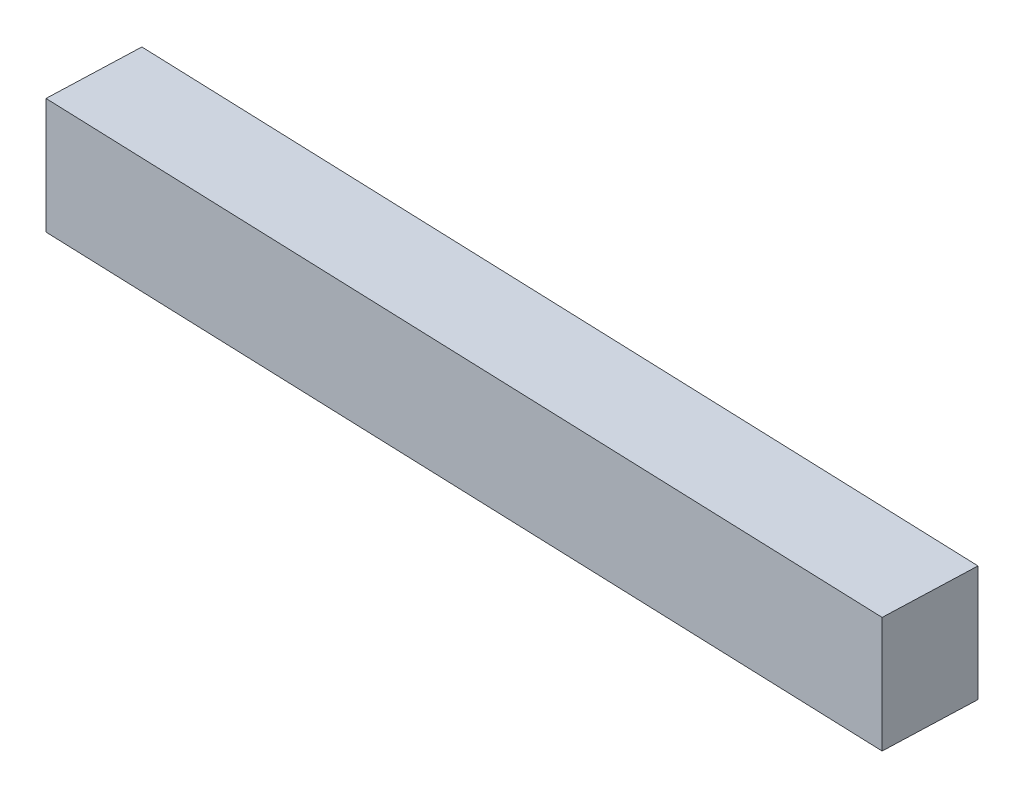
ISO-10303-21;
HEADER;
FILE_DESCRIPTION(('STEP AP214'),'2;1');
FILE_NAME('part.step','',(''),(''),'','','');
FILE_SCHEMA(('AUTOMOTIVE_DESIGN { 1 0 10303 214 1 1 1 1 }'));
ENDSEC;
DATA;
#1=APPLICATION_CONTEXT('core data for automotive mechanical design processes');
#2=APPLICATION_PROTOCOL_DEFINITION('international standard','automotive_design',2000,#1);
#3=PRODUCT_CONTEXT('',#1,'mechanical');
#4=PRODUCT('Part','Part','',(#3));
#5=PRODUCT_RELATED_PRODUCT_CATEGORY('part','',(#4));
#6=PRODUCT_DEFINITION_FORMATION('','',#4);
#7=PRODUCT_DEFINITION_CONTEXT('part definition',#1,'design');
#8=PRODUCT_DEFINITION('design','',#6,#7);
#9=PRODUCT_DEFINITION_SHAPE('','',#8);
#10=(LENGTH_UNIT() NAMED_UNIT(*) SI_UNIT(.MILLI.,.METRE.));
#11=(NAMED_UNIT(*) PLANE_ANGLE_UNIT() SI_UNIT($,.RADIAN.));
#12=(NAMED_UNIT(*) SI_UNIT($,.STERADIAN.) SOLID_ANGLE_UNIT());
#13=UNCERTAINTY_MEASURE_WITH_UNIT(LENGTH_MEASURE(1.E-05),#10,'distance_accuracy_value','');
#14=(GEOMETRIC_REPRESENTATION_CONTEXT(3) GLOBAL_UNCERTAINTY_ASSIGNED_CONTEXT((#13)) GLOBAL_UNIT_ASSIGNED_CONTEXT((#10,
#11,#12)) REPRESENTATION_CONTEXT('',''));
#15=CARTESIAN_POINT('',(0.,0.,0.));
#16=DIRECTION('',(0.,0.,1.));
#17=DIRECTION('',(1.,0.,0.));
#18=AXIS2_PLACEMENT_3D('',#15,#16,#17);
#19=CARTESIAN_POINT('',(-17.9885083295728,7.874,-0.549858282075033));
#20=DIRECTION('',(0.0361553403669387,0.,-0.999346181942449));
#21=DIRECTION('',(-0.999346181942449,0.,-0.0361553403669387));
#22=AXIS2_PLACEMENT_3D('',#19,#20,#21);
#23=PLANE('',#22);
#24=DIRECTION('',(0.,1.,0.));
#25=VECTOR('',#24,1.);
#26=CARTESIAN_POINT('',(-17.9885083295728,7.874,-0.549858282075033));
#27=LINE('',#26,#25);
#28=CARTESIAN_POINT('',(-17.9885083295728,7.62,-0.549858282075033));
#29=VERTEX_POINT('',#28);
#30=CARTESIAN_POINT('',(-17.9885083295728,7.874,-0.549858282075033));
#31=VERTEX_POINT('',#30);
#32=EDGE_CURVE('E20',#29,#31,#27,.T.);
#33=ORIENTED_EDGE('',*,*,#32,.T.);
#34=DIRECTION('',(0.999346181942449,0.,0.0361553403669398));
#35=VECTOR('',#34,1.);
#36=CARTESIAN_POINT('',(-19.8922628061731,7.874,-0.618734205474051));
#37=LINE('',#36,#35);
#38=CARTESIAN_POINT('',(-19.8922628061731,7.874,-0.61873420547405));
#39=VERTEX_POINT('',#38);
#40=EDGE_CURVE('E55',#39,#31,#37,.T.);
#41=ORIENTED_EDGE('',*,*,#40,.F.);
#42=DIRECTION('',(0.,1.,0.));
#43=VECTOR('',#42,1.);
#44=CARTESIAN_POINT('',(-19.8922628061731,7.874,-0.618734205474051));
#45=LINE('',#44,#43);
#46=CARTESIAN_POINT('',(-19.8922628061731,7.62,-0.61873420547405));
#47=VERTEX_POINT('',#46);
#48=EDGE_CURVE('E76',#39,#47,#45,.F.);
#49=ORIENTED_EDGE('',*,*,#48,.T.);
#50=DIRECTION('',(0.999346181942449,0.,0.0361553403669398));
#51=VECTOR('',#50,1.);
#52=CARTESIAN_POINT('',(-19.8922628061731,7.62,-0.618734205474051));
#53=LINE('',#52,#51);
#54=EDGE_CURVE('E58',#47,#29,#53,.T.);
#55=ORIENTED_EDGE('',*,*,#54,.T.);
#56=EDGE_LOOP('',(#33,#41,#49,#55));
#57=FACE_BOUND('',#56,.T.);
#58=ADVANCED_FACE('F17',(#57),#23,.F.);
#59=CARTESIAN_POINT('',(-17.9885083295728,7.874,-0.549858282075033));
#60=DIRECTION('',(-0.99934618194245,0.,-0.0361553403669117));
#61=DIRECTION('',(-0.0361553403669117,0.,0.99934618194245));
#62=AXIS2_PLACEMENT_3D('',#59,#60,#61);
#63=PLANE('',#62);
#64=DIRECTION('',(0.,1.,0.));
#65=VECTOR('',#64,1.);
#66=CARTESIAN_POINT('',(-17.9811615644102,7.874,-0.752925426245745));
#67=LINE('',#66,#65);
#68=CARTESIAN_POINT('',(-17.9811615644102,7.62,-0.752925426245746));
#69=VERTEX_POINT('',#68);
#70=CARTESIAN_POINT('',(-17.9811615644102,7.874,-0.752925426245746));
#71=VERTEX_POINT('',#70);
#72=EDGE_CURVE('E73',#69,#71,#67,.T.);
#73=ORIENTED_EDGE('',*,*,#72,.T.);
#74=DIRECTION('',(0.0361553403671163,0.,-0.999346181942443));
#75=VECTOR('',#74,1.);
#76=CARTESIAN_POINT('',(-17.9885083295728,7.874,-0.549858282075033));
#77=LINE('',#76,#75);
#78=EDGE_CURVE('E63',#31,#71,#77,.T.);
#79=ORIENTED_EDGE('',*,*,#78,.F.);
#80=ORIENTED_EDGE('',*,*,#32,.F.);
#81=DIRECTION('',(0.0361553403671163,0.,-0.999346181942443));
#82=VECTOR('',#81,1.);
#83=CARTESIAN_POINT('',(-17.9885083295728,7.62,-0.549858282075033));
#84=LINE('',#83,#82);
#85=EDGE_CURVE('E80',#29,#69,#84,.T.);
#86=ORIENTED_EDGE('',*,*,#85,.T.);
#87=EDGE_LOOP('',(#73,#79,#80,#86));
#88=FACE_BOUND('',#87,.T.);
#89=ADVANCED_FACE('F72',(#88),#63,.F.);
#90=CARTESIAN_POINT('',(-17.9811615644102,7.874,-0.752925426245745));
#91=DIRECTION('',(0.,1.,0.));
#92=DIRECTION('',(0.,0.,1.));
#93=AXIS2_PLACEMENT_3D('',#90,#91,#92);
#94=PLANE('',#93);
#95=DIRECTION('',(0.0361553388456142,0.,-0.999346181997489));
#96=VECTOR('',#95,1.);
#97=CARTESIAN_POINT('',(-19.8922628061731,7.874,-0.618734205474051));
#98=LINE('',#97,#96);
#99=CARTESIAN_POINT('',(-19.8849160413197,7.874,-0.821801349655945));
#100=VERTEX_POINT('',#99);
#101=EDGE_CURVE('E69',#100,#39,#98,.F.);
#102=ORIENTED_EDGE('',*,*,#101,.T.);
#103=ORIENTED_EDGE('',*,*,#40,.T.);
#104=ORIENTED_EDGE('',*,*,#78,.T.);
#105=DIRECTION('',(0.999346181942449,0.,0.0361553403669377));
#106=VECTOR('',#105,1.);
#107=CARTESIAN_POINT('',(-17.9811615644102,7.874,-0.752925426245745));
#108=LINE('',#107,#106);
#109=EDGE_CURVE('E83',#71,#100,#108,.F.);
#110=ORIENTED_EDGE('',*,*,#109,.T.);
#111=EDGE_LOOP('',(#102,#103,#104,#110));
#112=FACE_BOUND('',#111,.T.);
#113=ADVANCED_FACE('F66',(#112),#94,.T.);
#114=CARTESIAN_POINT('',(-19.8922628061731,7.874,-0.618734205474051));
#115=DIRECTION('',(0.999346181997489,0.,0.0361553388456142));
#116=DIRECTION('',(0.0361553388456142,0.,-0.999346181997489));
#117=AXIS2_PLACEMENT_3D('',#114,#115,#116);
#118=PLANE('',#117);
#119=ORIENTED_EDGE('',*,*,#48,.F.);
#120=ORIENTED_EDGE('',*,*,#101,.F.);
#121=DIRECTION('',(0.,1.,0.));
#122=VECTOR('',#121,1.);
#123=CARTESIAN_POINT('',(-19.8849160413197,7.874,-0.821801349655945));
#124=LINE('',#123,#122);
#125=CARTESIAN_POINT('',(-19.8849160413197,7.62,-0.821801349655945));
#126=VERTEX_POINT('',#125);
#127=EDGE_CURVE('E26',#100,#126,#124,.F.);
#128=ORIENTED_EDGE('',*,*,#127,.T.);
#129=DIRECTION('',(-0.0361553388454777,0.,0.999346181997494));
#130=VECTOR('',#129,1.);
#131=CARTESIAN_POINT('',(-19.8849160413197,7.62,-0.821801349655945));
#132=LINE('',#131,#130);
#133=EDGE_CURVE('E34',#126,#47,#132,.T.);
#134=ORIENTED_EDGE('',*,*,#133,.T.);
#135=EDGE_LOOP('',(#119,#120,#128,#134));
#136=FACE_BOUND('',#135,.T.);
#137=ADVANCED_FACE('F88',(#136),#118,.F.);
#138=CARTESIAN_POINT('',(-17.9811615644102,7.62,-0.752925426245745));
#139=DIRECTION('',(0.,1.,0.));
#140=DIRECTION('',(0.,0.,1.));
#141=AXIS2_PLACEMENT_3D('',#138,#139,#140);
#142=PLANE('',#141);
#143=ORIENTED_EDGE('',*,*,#54,.F.);
#144=ORIENTED_EDGE('',*,*,#133,.F.);
#145=DIRECTION('',(0.999346181942449,0.,0.0361553403669377));
#146=VECTOR('',#145,1.);
#147=CARTESIAN_POINT('',(-17.9811615644102,7.62,-0.752925426245745));
#148=LINE('',#147,#146);
#149=EDGE_CURVE('E11',#126,#69,#148,.T.);
#150=ORIENTED_EDGE('',*,*,#149,.T.);
#151=ORIENTED_EDGE('',*,*,#85,.F.);
#152=EDGE_LOOP('',(#143,#144,#150,#151));
#153=FACE_BOUND('',#152,.T.);
#154=ADVANCED_FACE('F91',(#153),#142,.F.);
#155=CARTESIAN_POINT('',(-17.9811615644102,7.874,-0.752925426245745));
#156=DIRECTION('',(-0.0361553403669377,0.,0.999346181942449));
#157=DIRECTION('',(0.999346181942449,0.,0.0361553403669377));
#158=AXIS2_PLACEMENT_3D('',#155,#156,#157);
#159=PLANE('',#158);
#160=ORIENTED_EDGE('',*,*,#127,.F.);
#161=ORIENTED_EDGE('',*,*,#109,.F.);
#162=ORIENTED_EDGE('',*,*,#72,.F.);
#163=ORIENTED_EDGE('',*,*,#149,.F.);
#164=EDGE_LOOP('',(#160,#161,#162,#163));
#165=FACE_BOUND('',#164,.T.);
#166=ADVANCED_FACE('F90',(#165),#159,.F.);
#167=CLOSED_SHELL('',(#58,#89,#113,#137,#154,#166));
#168=MANIFOLD_SOLID_BREP('B1',#167);
#169=ADVANCED_BREP_SHAPE_REPRESENTATION('',(#18,#168),#14);
#170=SHAPE_DEFINITION_REPRESENTATION(#9,#169);
ENDSEC;
END-ISO-10303-21;
